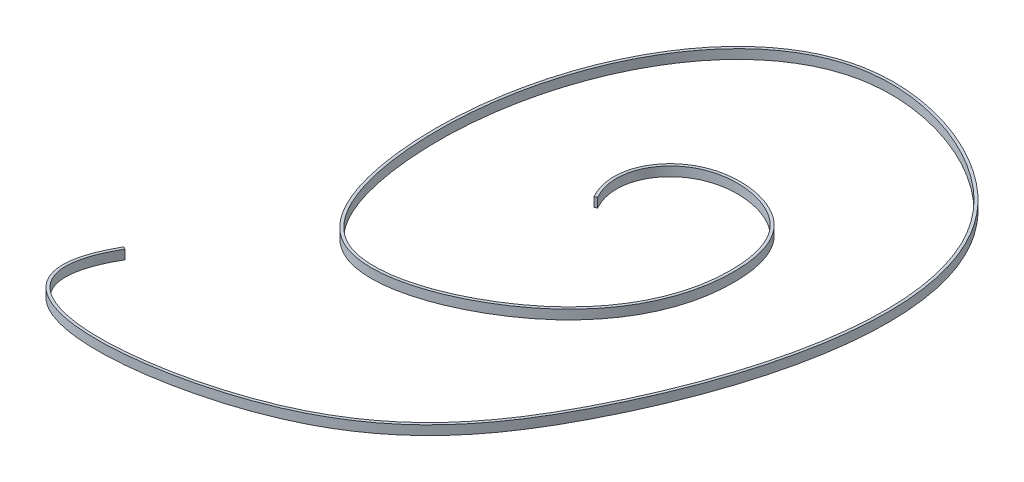
ISO-10303-21;
HEADER;
FILE_DESCRIPTION(('STEP AP214'),'2;1');
FILE_NAME('part.step','',(''),(''),'','','');
FILE_SCHEMA(('AUTOMOTIVE_DESIGN { 1 0 10303 214 1 1 1 1 }'));
ENDSEC;
DATA;
#1=APPLICATION_CONTEXT('core data for automotive mechanical design processes');
#2=APPLICATION_PROTOCOL_DEFINITION('international standard','automotive_design',2000,#1);
#3=PRODUCT_CONTEXT('',#1,'mechanical');
#4=PRODUCT('Part','Part','',(#3));
#5=PRODUCT_RELATED_PRODUCT_CATEGORY('part','',(#4));
#6=PRODUCT_DEFINITION_FORMATION('','',#4);
#7=PRODUCT_DEFINITION_CONTEXT('part definition',#1,'design');
#8=PRODUCT_DEFINITION('design','',#6,#7);
#9=PRODUCT_DEFINITION_SHAPE('','',#8);
#10=(LENGTH_UNIT() NAMED_UNIT(*) SI_UNIT(.MILLI.,.METRE.));
#11=(NAMED_UNIT(*) PLANE_ANGLE_UNIT() SI_UNIT($,.RADIAN.));
#12=(NAMED_UNIT(*) SI_UNIT($,.STERADIAN.) SOLID_ANGLE_UNIT());
#13=UNCERTAINTY_MEASURE_WITH_UNIT(LENGTH_MEASURE(1.E-05),#10,'distance_accuracy_value','');
#14=(GEOMETRIC_REPRESENTATION_CONTEXT(3) GLOBAL_UNCERTAINTY_ASSIGNED_CONTEXT((#13)) GLOBAL_UNIT_ASSIGNED_CONTEXT((#10,
#11,#12)) REPRESENTATION_CONTEXT('',''));
#15=CARTESIAN_POINT('',(0.,0.,0.));
#16=DIRECTION('',(0.,0.,1.));
#17=DIRECTION('',(1.,0.,0.));
#18=AXIS2_PLACEMENT_3D('',#15,#16,#17);
#19=CARTESIAN_POINT('',(1.31157343753039,10.,-0.727856522925171));
#20=CARTESIAN_POINT('',(-1.99609170628711,10.,-6.68815997042503));
#21=CARTESIAN_POINT('',(-4.13255155921997,10.,-12.6699174934191));
#22=CARTESIAN_POINT('',(-6.36912068990896,10.,-24.443140012303));
#23=CARTESIAN_POINT('',(-6.46940317318312,10.,-30.2357425788563));
#24=CARTESIAN_POINT('',(-4.91410915895743,10.,-41.4046321738258));
#25=CARTESIAN_POINT('',(-3.25770484369592,10.,-46.7811936654338));
#26=CARTESIAN_POINT('',(1.54542978061375,10.,-56.871060500445));
#27=CARTESIAN_POINT('',(4.69248721590024,10.,-61.5838849077719));
#28=CARTESIAN_POINT('',(12.2045931030961,10.,-70.0841316503236));
#29=CARTESIAN_POINT('',(16.5695042008434,10.,-73.8712264378421));
#30=CARTESIAN_POINT('',(23.8196261863979,10.,-78.6608436658613));
#31=CARTESIAN_POINT('',(26.3534124304733,10.,-80.1089050709138));
#32=CARTESIAN_POINT('',(31.6198078682662,10.,-82.6757838188294));
#33=CARTESIAN_POINT('',(34.3531734441648,10.,-83.791748201238));
#34=CARTESIAN_POINT('',(42.8006715583312,10.,-86.6339048561434));
#35=CARTESIAN_POINT('',(48.7559271669362,10.,-87.8587792209771));
#36=CARTESIAN_POINT('',(60.9143737105636,10.,-89.0178150748183));
#37=CARTESIAN_POINT('',(67.1173021623212,10.,-88.9519614584062));
#38=CARTESIAN_POINT('',(79.3661911278564,10.,-87.5871106422524));
#39=CARTESIAN_POINT('',(85.4120161419023,10.,-86.2881193855158));
#40=CARTESIAN_POINT('',(96.9424468115446,10.,-82.5229146456646));
#41=CARTESIAN_POINT('',(102.42680817608,10.,-80.0567212039048));
#42=CARTESIAN_POINT('',(112.435487047903,10.,-74.0313000891629));
#43=CARTESIAN_POINT('',(116.959356105377,10.,-70.4725244122631));
#44=CARTESIAN_POINT('',(124.664180691393,10.,-62.3394873161674));
#45=CARTESIAN_POINT('',(127.853337183156,10.,-57.744543750985));
#46=CARTESIAN_POINT('',(133.081569629047,10.,-47.7659314685345));
#47=CARTESIAN_POINT('',(135.118820474709,10.,-42.3837935002649));
#48=CARTESIAN_POINT('',(138.199836067153,10.,-31.1334306419113));
#49=CARTESIAN_POINT('',(139.243429056927,10.,-25.2656583364093));
#50=CARTESIAN_POINT('',(140.502872496692,10.,-13.3556098953358));
#51=CARTESIAN_POINT('',(140.71880941315,10.,-7.31349438731036));
#52=CARTESIAN_POINT('',(140.495323505991,10.,4.63224052843893));
#53=CARTESIAN_POINT('',(140.060940932236,10.,10.5220480301137));
#54=CARTESIAN_POINT('',(136.340032543762,10.,39.5017447543877));
#55=CARTESIAN_POINT('',(128.402862927538,10.,61.2111739880526));
#56=CARTESIAN_POINT('',(104.042296717968,10.,100.871958138674));
#57=CARTESIAN_POINT('',(87.6155947266078,10.,118.821726896916));
#58=CARTESIAN_POINT('',(65.1678667668593,10.,136.40161160724));
#59=CARTESIAN_POINT('',(62.6185952193579,10.,138.318609717023));
#60=CARTESIAN_POINT('',(57.4127494695411,10.,142.078205514152));
#61=CARTESIAN_POINT('',(54.7554694847654,10.,143.92133933439));
#62=CARTESIAN_POINT('',(46.6411237962217,10.,149.325758874715));
#63=CARTESIAN_POINT('',(41.0421475796716,10.,152.761585969065));
#64=CARTESIAN_POINT('',(23.8533071058503,10.,162.439622917565));
#65=CARTESIAN_POINT('',(11.8712842959876,10.,168.052102838419));
#66=CARTESIAN_POINT('',(-12.1938714542314,10.,176.921373193283));
#67=CARTESIAN_POINT('',(-24.2770989572398,10.,180.177641905063));
#68=CARTESIAN_POINT('',(-47.5908203601184,10.,183.672475007568));
#69=CARTESIAN_POINT('',(-58.8195400827275,10.,183.909880079647));
#70=CARTESIAN_POINT('',(-74.3112395067035,10.,181.537318443806));
#71=CARTESIAN_POINT('',(-79.2500916607095,10.,180.29232115226));
#72=CARTESIAN_POINT('',(-86.2395838428847,10.,177.688128891691));
#73=CARTESIAN_POINT('',(-88.4997078592383,10.,176.697279088005));
#74=CARTESIAN_POINT('',(-92.8681274511122,10.,174.460195842698));
#75=CARTESIAN_POINT('',(-94.9762332683239,10.,173.211910438323));
#76=CARTESIAN_POINT('',(-101.085544681221,10.,169.090184786714));
#77=CARTESIAN_POINT('',(-104.870125116999,10.,165.842906028924));
#78=CARTESIAN_POINT('',(-111.894042753897,10.,158.461064366247));
#79=CARTESIAN_POINT('',(-115.133045801923,10.,154.326453836099));
#80=CARTESIAN_POINT('',(-124.067378932293,10.,140.770970923907));
#81=CARTESIAN_POINT('',(-128.978370213353,10.,130.197602171288));
#82=CARTESIAN_POINT('',(-136.912474882741,10.,106.994667209095));
#83=CARTESIAN_POINT('',(-139.936125657045,10.,94.3664704436047));
#84=CARTESIAN_POINT('',(-143.230781207815,10.,74.656879555683));
#85=CARTESIAN_POINT('',(-144.122364555622,10.,67.9591203372012));
#86=CARTESIAN_POINT('',(-145.172615982765,10.,57.817001917743));
#87=CARTESIAN_POINT('',(-145.47485069501,10.,54.4203804470025));
#88=CARTESIAN_POINT('',(-145.987474307717,10.,47.6113454842854));
#89=CARTESIAN_POINT('',(-146.198052167488,10.,44.1997934345628));
#90=CARTESIAN_POINT('',(-147.025154309732,10.,27.1215886306202));
#91=CARTESIAN_POINT('',(-146.963580587337,10.,13.3891341095652));
#92=CARTESIAN_POINT('',(-144.692989913643,10.,-27.6293334419072));
#93=CARTESIAN_POINT('',(-140.397737299061,10.,-54.7364283047862));
#94=CARTESIAN_POINT('',(-126.700244075146,10.,-106.400459502458));
#95=CARTESIAN_POINT('',(-117.297843058788,10.,-130.957151305564));
#96=CARTESIAN_POINT('',(-93.8557222259403,10.,-175.450057709756));
#97=CARTESIAN_POINT('',(-79.8162134753282,10.,-195.385256664037));
#98=CARTESIAN_POINT('',(-47.5860666707704,10.,-228.583954194929));
#99=CARTESIAN_POINT('',(-29.3986762321867,10.,-241.84687364427));
#100=CARTESIAN_POINT('',(0.649007777999809,10.,-255.240164779458));
#101=CARTESIAN_POINT('',(11.1267135327442,10.,-258.621702469332));
#102=CARTESIAN_POINT('',(27.5017166649118,10.,-261.882475557225));
#103=CARTESIAN_POINT('',(33.0745547335467,10.,-262.663748219751));
#104=CARTESIAN_POINT('',(44.3987289852908,10.,-263.635776201996));
#105=CARTESIAN_POINT('',(50.1481711494491,10.,-263.827394390031));
#106=CARTESIAN_POINT('',(79.1728224081749,10.,-263.38042841196));
#107=CARTESIAN_POINT('',(103.280622347588,10.,-258.523283292028));
#108=CARTESIAN_POINT('',(149.169496535976,10.,-241.583691085349));
#109=CARTESIAN_POINT('',(170.949387785612,10.,-229.502043707169));
#110=CARTESIAN_POINT('',(194.165777185925,10.,-211.034404944831));
#111=CARTESIAN_POINT('',(198.608724961932,10.,-207.172741250086));
#112=CARTESIAN_POINT('',(207.030682203292,10.,-199.142436023637));
#113=CARTESIAN_POINT('',(211.007685494834,10.,-194.974504537302));
#114=CARTESIAN_POINT('',(222.162465474313,10.,-182.049282089746));
#115=CARTESIAN_POINT('',(228.588221395688,10.,-172.866101466427));
#116=CARTESIAN_POINT('',(245.071573692531,10.,-143.857275578462));
#117=CARTESIAN_POINT('',(252.336283803175,10.,-122.569596321426));
#118=CARTESIAN_POINT('',(260.630827874101,10.,-77.4108419727723));
#119=CARTESIAN_POINT('',(261.658662865922,10.,-53.5413305038955));
#120=CARTESIAN_POINT('',(258.688502123931,10.,-4.58670232280617));
#121=CARTESIAN_POINT('',(254.690760989839,10.,20.497534892462));
#122=CARTESIAN_POINT('',(237.007521100834,10.,95.5100039542261));
#123=CARTESIAN_POINT('',(217.63079641841,10.,145.196395131923));
#124=CARTESIAN_POINT('',(192.892756008592,10.,194.568135399149));
#125=CARTESIAN_POINT('',(190.106364010508,10.,199.961951640808));
#126=CARTESIAN_POINT('',(184.450386975812,10.,210.554420093338));
#127=CARTESIAN_POINT('',(181.578728209937,10.,215.754280357854));
#128=CARTESIAN_POINT('',(172.798289135462,10.,231.061712126637));
#129=CARTESIAN_POINT('',(166.724058549423,10.,240.877089300397));
#130=CARTESIAN_POINT('',(147.563805489502,10.,269.131698772121));
#131=CARTESIAN_POINT('',(133.54115381236,10.,286.378864092585));
#132=CARTESIAN_POINT('',(101.514202322097,10.,317.589241324339));
#133=CARTESIAN_POINT('',(83.5096387267078,10.,331.553886038375));
#134=CARTESIAN_POINT('',(52.3826362084777,10.,349.958177034545));
#135=CARTESIAN_POINT('',(41.3200939309696,10.,355.668952646261));
#136=CARTESIAN_POINT('',(23.5541044168628,10.,363.586759638323));
#137=CARTESIAN_POINT('',(17.4367523239497,10.,366.117953849826));
#138=CARTESIAN_POINT('',(7.95004488038671,10.,369.750974886365));
#139=CARTESIAN_POINT('',(4.73602990378553,10.,370.934686232475));
#140=CARTESIAN_POINT('',(-1.79849047913696,10.,373.247235108946));
#141=CARTESIAN_POINT('',(-5.12028042724947,10.,374.376424377797));
#142=CARTESIAN_POINT('',(-35.442005731669,10.,384.272815821242));
#143=CARTESIAN_POINT('',(-65.3996955295021,10.,391.167222422291));
#144=CARTESIAN_POINT('',(-108.442611061017,10.,396.525896622707));
#145=CARTESIAN_POINT('',(-122.474710353097,10.,397.481842170444));
#146=CARTESIAN_POINT('',(-148.832397171833,10.,397.386900619266));
#147=CARTESIAN_POINT('',(-161.158174933573,10.,396.334797695182));
#148=CARTESIAN_POINT('',(-177.548664533204,10.,393.009633292294));
#149=CARTESIAN_POINT('',(-182.662209161285,10.,391.610370336129));
#150=CARTESIAN_POINT('',(-192.05329997467,10.,388.197503122953));
#151=CARTESIAN_POINT('',(-196.330413608328,10.,386.18396892745));
#152=CARTESIAN_POINT('',(-203.920565243992,10.,381.517281615985));
#153=CARTESIAN_POINT('',(-207.233180499266,10.,378.865097360051));
#154=CARTESIAN_POINT('',(-212.790198571741,10.,372.890805510295));
#155=CARTESIAN_POINT('',(-215.036169408234,10.,369.569606578398));
#156=CARTESIAN_POINT('',(-218.370114980303,10.,362.184995399195));
#157=CARTESIAN_POINT('',(-219.459180003198,10.,358.119250331255));
#158=CARTESIAN_POINT('',(-220.34620941465,10.,349.14698359439));
#159=CARTESIAN_POINT('',(-220.142451433591,10.,344.239824948314));
#160=CARTESIAN_POINT('',(-218.279816268623,10.,333.52490598928));
#161=CARTESIAN_POINT('',(-216.620467855819,10.,327.718114350905));
#162=CARTESIAN_POINT('',(-211.695807660268,10.,315.170365252245));
#163=CARTESIAN_POINT('',(-208.430732547278,10.,308.429791124968));
#164=CARTESIAN_POINT('',(-204.293701014468,10.,301.205797866783));
#165=B_SPLINE_CURVE_WITH_KNOTS('',3,(#19,#20,#21,#22,#23,#24,#25,#26,#27,#28,#29,#30,#31,#32,
#33,#34,#35,#36,#37,#38,#39,#40,#41,#42,#43,#44,#45,#46,#47,#48,#49,#50,#51,#52,#53,#54,#55,#56,
#57,#58,#59,#60,#61,#62,#63,#64,#65,#66,#67,#68,#69,#70,#71,#72,#73,#74,#75,#76,#77,#78,#79,#80,
#81,#82,#83,#84,#85,#86,#87,#88,#89,#90,#91,#92,#93,#94,#95,#96,#97,#98,#99,#100,#101,#102,#103,
#104,#105,#106,#107,#108,#109,#110,#111,#112,#113,#114,#115,#116,#117,#118,#119,#120,#121,#122,
#123,#124,#125,#126,#127,#128,#129,#130,#131,#132,#133,#134,#135,#136,#137,#138,#139,#140,#141,
#142,#143,#144,#145,#146,#147,#148,#149,#150,#151,#152,#153,#154,#155,#156,#157,#158,#159,#160,
#161,#162,#163,#164),.UNSPECIFIED.,.F.,.F.,(4,2,2,2,2,2,2,2,2,2,2,2,2,2,2,2,2,2,2,2,2,2,2,2,2,2,
2,2,2,2,2,2,2,2,2,2,2,2,2,2,2,2,2,2,2,2,2,2,2,2,2,2,2,2,2,2,2,2,2,2,2,2,2,2,2,2,2,2,2,2,2,2,4),
(0.,0.0078125,0.015625,0.0234375,0.03125,0.0390625,0.04296875,0.046875,0.0546875,0.0625,
0.0703125,0.078125,0.0859375,0.09375,0.1015625,0.109375,0.1171875,0.125,0.15625,0.1875,
0.19140625,0.1953125,0.203125,0.21875,0.234375,0.25,0.2578125,0.26171875,0.265625,0.2734375,
0.28125,0.296875,0.3125,0.3203125,0.32421875,0.328125,0.34375,0.375,0.40625,0.4375,0.46875,
0.484375,0.4921875,0.5,0.53125,0.5625,0.5703125,0.578125,0.59375,0.625,0.65625,0.6875,0.75,
0.7578125,0.765625,0.78125,0.8125,0.84375,0.859375,0.8671875,0.87109375,0.875,0.90625,0.921875,
0.9375,0.9453125,0.953125,0.9609375,0.96875,0.9765625,0.984375,0.9921875,1.),.UNSPECIFIED.);
#166=DIRECTION('',(0.,-1.,0.));
#167=VECTOR('',#166,1.);
#168=SURFACE_OF_LINEAR_EXTRUSION('',#165,#167);
#169=CARTESIAN_POINT('',(1.31157343753039,0.,-0.727856522925171));
#170=CARTESIAN_POINT('',(-1.99609170628711,0.,-6.68815997042503));
#171=CARTESIAN_POINT('',(-4.13255155921997,0.,-12.6699174934191));
#172=CARTESIAN_POINT('',(-6.36912068990896,0.,-24.443140012303));
#173=CARTESIAN_POINT('',(-6.46940317318312,0.,-30.2357425788563));
#174=CARTESIAN_POINT('',(-4.91410915895743,0.,-41.4046321738258));
#175=CARTESIAN_POINT('',(-3.25770484369592,0.,-46.7811936654338));
#176=CARTESIAN_POINT('',(1.54542978061375,0.,-56.871060500445));
#177=CARTESIAN_POINT('',(4.69248721590024,0.,-61.5838849077719));
#178=CARTESIAN_POINT('',(12.2045931030961,0.,-70.0841316503236));
#179=CARTESIAN_POINT('',(16.5695042008434,0.,-73.8712264378421));
#180=CARTESIAN_POINT('',(23.8196261863979,0.,-78.6608436658613));
#181=CARTESIAN_POINT('',(26.3534124304733,0.,-80.1089050709138));
#182=CARTESIAN_POINT('',(31.6198078682662,0.,-82.6757838188294));
#183=CARTESIAN_POINT('',(34.3531734441648,0.,-83.791748201238));
#184=CARTESIAN_POINT('',(42.8006715583312,0.,-86.6339048561434));
#185=CARTESIAN_POINT('',(48.7559271669362,0.,-87.8587792209771));
#186=CARTESIAN_POINT('',(60.9143737105636,0.,-89.0178150748183));
#187=CARTESIAN_POINT('',(67.1173021623212,0.,-88.9519614584062));
#188=CARTESIAN_POINT('',(79.3661911278564,0.,-87.5871106422524));
#189=CARTESIAN_POINT('',(85.4120161419023,0.,-86.2881193855158));
#190=CARTESIAN_POINT('',(96.9424468115446,0.,-82.5229146456646));
#191=CARTESIAN_POINT('',(102.42680817608,0.,-80.0567212039048));
#192=CARTESIAN_POINT('',(112.435487047903,0.,-74.0313000891629));
#193=CARTESIAN_POINT('',(116.959356105377,0.,-70.4725244122631));
#194=CARTESIAN_POINT('',(124.664180691393,0.,-62.3394873161674));
#195=CARTESIAN_POINT('',(127.853337183156,0.,-57.744543750985));
#196=CARTESIAN_POINT('',(133.081569629047,0.,-47.7659314685345));
#197=CARTESIAN_POINT('',(135.118820474709,0.,-42.3837935002649));
#198=CARTESIAN_POINT('',(138.199836067153,0.,-31.1334306419113));
#199=CARTESIAN_POINT('',(139.243429056927,0.,-25.2656583364093));
#200=CARTESIAN_POINT('',(140.502872496692,0.,-13.3556098953358));
#201=CARTESIAN_POINT('',(140.71880941315,0.,-7.31349438731036));
#202=CARTESIAN_POINT('',(140.495323505991,0.,4.63224052843893));
#203=CARTESIAN_POINT('',(140.060940932236,0.,10.5220480301137));
#204=CARTESIAN_POINT('',(136.340032543762,0.,39.5017447543877));
#205=CARTESIAN_POINT('',(128.402862927538,0.,61.2111739880526));
#206=CARTESIAN_POINT('',(104.042296717968,0.,100.871958138674));
#207=CARTESIAN_POINT('',(87.6155947266078,0.,118.821726896916));
#208=CARTESIAN_POINT('',(65.1678667668593,0.,136.40161160724));
#209=CARTESIAN_POINT('',(62.6185952193579,0.,138.318609717023));
#210=CARTESIAN_POINT('',(57.4127494695411,0.,142.078205514152));
#211=CARTESIAN_POINT('',(54.7554694847654,0.,143.92133933439));
#212=CARTESIAN_POINT('',(46.6411237962217,0.,149.325758874715));
#213=CARTESIAN_POINT('',(41.0421475796716,0.,152.761585969065));
#214=CARTESIAN_POINT('',(23.8533071058503,0.,162.439622917565));
#215=CARTESIAN_POINT('',(11.8712842959876,0.,168.052102838419));
#216=CARTESIAN_POINT('',(-12.1938714542314,0.,176.921373193283));
#217=CARTESIAN_POINT('',(-24.2770989572398,0.,180.177641905063));
#218=CARTESIAN_POINT('',(-47.5908203601184,0.,183.672475007568));
#219=CARTESIAN_POINT('',(-58.8195400827275,0.,183.909880079647));
#220=CARTESIAN_POINT('',(-74.3112395067035,0.,181.537318443806));
#221=CARTESIAN_POINT('',(-79.2500916607095,0.,180.29232115226));
#222=CARTESIAN_POINT('',(-86.2395838428847,0.,177.688128891691));
#223=CARTESIAN_POINT('',(-88.4997078592383,0.,176.697279088005));
#224=CARTESIAN_POINT('',(-92.8681274511122,0.,174.460195842698));
#225=CARTESIAN_POINT('',(-94.9762332683239,0.,173.211910438323));
#226=CARTESIAN_POINT('',(-101.085544681221,0.,169.090184786714));
#227=CARTESIAN_POINT('',(-104.870125116999,0.,165.842906028924));
#228=CARTESIAN_POINT('',(-111.894042753897,0.,158.461064366247));
#229=CARTESIAN_POINT('',(-115.133045801923,0.,154.326453836099));
#230=CARTESIAN_POINT('',(-124.067378932293,0.,140.770970923907));
#231=CARTESIAN_POINT('',(-128.978370213353,0.,130.197602171288));
#232=CARTESIAN_POINT('',(-136.912474882741,0.,106.994667209095));
#233=CARTESIAN_POINT('',(-139.936125657045,0.,94.3664704436047));
#234=CARTESIAN_POINT('',(-143.230781207815,0.,74.656879555683));
#235=CARTESIAN_POINT('',(-144.122364555622,0.,67.9591203372012));
#236=CARTESIAN_POINT('',(-145.172615982765,0.,57.817001917743));
#237=CARTESIAN_POINT('',(-145.47485069501,0.,54.4203804470025));
#238=CARTESIAN_POINT('',(-145.987474307717,0.,47.6113454842854));
#239=CARTESIAN_POINT('',(-146.198052167488,0.,44.1997934345628));
#240=CARTESIAN_POINT('',(-147.025154309732,0.,27.1215886306202));
#241=CARTESIAN_POINT('',(-146.963580587337,0.,13.3891341095652));
#242=CARTESIAN_POINT('',(-144.692989913643,0.,-27.6293334419072));
#243=CARTESIAN_POINT('',(-140.397737299061,0.,-54.7364283047862));
#244=CARTESIAN_POINT('',(-126.700244075146,0.,-106.400459502458));
#245=CARTESIAN_POINT('',(-117.297843058788,0.,-130.957151305564));
#246=CARTESIAN_POINT('',(-93.8557222259403,0.,-175.450057709756));
#247=CARTESIAN_POINT('',(-79.8162134753282,0.,-195.385256664037));
#248=CARTESIAN_POINT('',(-47.5860666707704,0.,-228.583954194929));
#249=CARTESIAN_POINT('',(-29.3986762321867,0.,-241.84687364427));
#250=CARTESIAN_POINT('',(0.649007777999809,0.,-255.240164779458));
#251=CARTESIAN_POINT('',(11.1267135327442,0.,-258.621702469332));
#252=CARTESIAN_POINT('',(27.5017166649118,0.,-261.882475557225));
#253=CARTESIAN_POINT('',(33.0745547335467,0.,-262.663748219751));
#254=CARTESIAN_POINT('',(44.3987289852908,0.,-263.635776201996));
#255=CARTESIAN_POINT('',(50.1481711494491,0.,-263.827394390031));
#256=CARTESIAN_POINT('',(79.1728224081749,0.,-263.38042841196));
#257=CARTESIAN_POINT('',(103.280622347588,0.,-258.523283292028));
#258=CARTESIAN_POINT('',(149.169496535976,0.,-241.583691085349));
#259=CARTESIAN_POINT('',(170.949387785612,0.,-229.502043707169));
#260=CARTESIAN_POINT('',(194.165777185925,0.,-211.034404944831));
#261=CARTESIAN_POINT('',(198.608724961932,0.,-207.172741250086));
#262=CARTESIAN_POINT('',(207.030682203292,0.,-199.142436023637));
#263=CARTESIAN_POINT('',(211.007685494834,0.,-194.974504537302));
#264=CARTESIAN_POINT('',(222.162465474313,0.,-182.049282089746));
#265=CARTESIAN_POINT('',(228.588221395688,0.,-172.866101466427));
#266=CARTESIAN_POINT('',(245.071573692531,0.,-143.857275578462));
#267=CARTESIAN_POINT('',(252.336283803175,0.,-122.569596321426));
#268=CARTESIAN_POINT('',(260.630827874101,0.,-77.4108419727723));
#269=CARTESIAN_POINT('',(261.658662865922,0.,-53.5413305038955));
#270=CARTESIAN_POINT('',(258.688502123931,0.,-4.58670232280617));
#271=CARTESIAN_POINT('',(254.690760989839,0.,20.497534892462));
#272=CARTESIAN_POINT('',(237.007521100834,0.,95.5100039542261));
#273=CARTESIAN_POINT('',(217.63079641841,0.,145.196395131923));
#274=CARTESIAN_POINT('',(192.892756008592,0.,194.568135399149));
#275=CARTESIAN_POINT('',(190.106364010508,0.,199.961951640808));
#276=CARTESIAN_POINT('',(184.450386975812,0.,210.554420093338));
#277=CARTESIAN_POINT('',(181.578728209937,0.,215.754280357854));
#278=CARTESIAN_POINT('',(172.798289135462,0.,231.061712126637));
#279=CARTESIAN_POINT('',(166.724058549423,0.,240.877089300397));
#280=CARTESIAN_POINT('',(147.563805489502,0.,269.131698772121));
#281=CARTESIAN_POINT('',(133.54115381236,0.,286.378864092585));
#282=CARTESIAN_POINT('',(101.514202322097,0.,317.589241324339));
#283=CARTESIAN_POINT('',(83.5096387267078,0.,331.553886038375));
#284=CARTESIAN_POINT('',(52.3826362084777,0.,349.958177034545));
#285=CARTESIAN_POINT('',(41.3200939309696,0.,355.668952646261));
#286=CARTESIAN_POINT('',(23.5541044168628,0.,363.586759638323));
#287=CARTESIAN_POINT('',(17.4367523239497,0.,366.117953849826));
#288=CARTESIAN_POINT('',(7.95004488038671,0.,369.750974886365));
#289=CARTESIAN_POINT('',(4.73602990378553,0.,370.934686232475));
#290=CARTESIAN_POINT('',(-1.79849047913696,0.,373.247235108946));
#291=CARTESIAN_POINT('',(-5.12028042724947,0.,374.376424377797));
#292=CARTESIAN_POINT('',(-35.442005731669,0.,384.272815821242));
#293=CARTESIAN_POINT('',(-65.3996955295021,0.,391.167222422291));
#294=CARTESIAN_POINT('',(-108.442611061017,0.,396.525896622707));
#295=CARTESIAN_POINT('',(-122.474710353097,0.,397.481842170444));
#296=CARTESIAN_POINT('',(-148.832397171833,0.,397.386900619266));
#297=CARTESIAN_POINT('',(-161.158174933573,0.,396.334797695182));
#298=CARTESIAN_POINT('',(-177.548664533204,0.,393.009633292294));
#299=CARTESIAN_POINT('',(-182.662209161285,0.,391.610370336129));
#300=CARTESIAN_POINT('',(-192.05329997467,0.,388.197503122953));
#301=CARTESIAN_POINT('',(-196.330413608328,0.,386.18396892745));
#302=CARTESIAN_POINT('',(-203.920565243992,0.,381.517281615985));
#303=CARTESIAN_POINT('',(-207.233180499266,0.,378.865097360051));
#304=CARTESIAN_POINT('',(-212.790198571741,0.,372.890805510295));
#305=CARTESIAN_POINT('',(-215.036169408234,0.,369.569606578398));
#306=CARTESIAN_POINT('',(-218.370114980303,0.,362.184995399195));
#307=CARTESIAN_POINT('',(-219.459180003198,0.,358.119250331255));
#308=CARTESIAN_POINT('',(-220.34620941465,0.,349.14698359439));
#309=CARTESIAN_POINT('',(-220.142451433591,0.,344.239824948314));
#310=CARTESIAN_POINT('',(-218.279816268623,0.,333.52490598928));
#311=CARTESIAN_POINT('',(-216.620467855819,0.,327.718114350905));
#312=CARTESIAN_POINT('',(-211.695807660268,0.,315.170365252245));
#313=CARTESIAN_POINT('',(-208.430732547278,0.,308.429791124968));
#314=CARTESIAN_POINT('',(-204.293701014468,0.,301.205797866783));
#315=B_SPLINE_CURVE_WITH_KNOTS('',3,(#169,#170,#171,#172,#173,#174,#175,#176,#177,#178,#179,
#180,#181,#182,#183,#184,#185,#186,#187,#188,#189,#190,#191,#192,#193,#194,#195,#196,#197,#198,
#199,#200,#201,#202,#203,#204,#205,#206,#207,#208,#209,#210,#211,#212,#213,#214,#215,#216,#217,
#218,#219,#220,#221,#222,#223,#224,#225,#226,#227,#228,#229,#230,#231,#232,#233,#234,#235,#236,
#237,#238,#239,#240,#241,#242,#243,#244,#245,#246,#247,#248,#249,#250,#251,#252,#253,#254,#255,
#256,#257,#258,#259,#260,#261,#262,#263,#264,#265,#266,#267,#268,#269,#270,#271,#272,#273,#274,
#275,#276,#277,#278,#279,#280,#281,#282,#283,#284,#285,#286,#287,#288,#289,#290,#291,#292,#293,
#294,#295,#296,#297,#298,#299,#300,#301,#302,#303,#304,#305,#306,#307,#308,#309,#310,#311,#312,
#313,#314),.UNSPECIFIED.,.F.,.F.,(4,2,2,2,2,2,2,2,2,2,2,2,2,2,2,2,2,2,2,2,2,2,2,2,2,2,2,2,2,2,2,
2,2,2,2,2,2,2,2,2,2,2,2,2,2,2,2,2,2,2,2,2,2,2,2,2,2,2,2,2,2,2,2,2,2,2,2,2,2,2,2,2,4),(0.,
0.0078125,0.015625,0.0234375,0.03125,0.0390625,0.04296875,0.046875,0.0546875,0.0625,0.0703125,
0.078125,0.0859375,0.09375,0.1015625,0.109375,0.1171875,0.125,0.15625,0.1875,0.19140625,
0.1953125,0.203125,0.21875,0.234375,0.25,0.2578125,0.26171875,0.265625,0.2734375,0.28125,
0.296875,0.3125,0.3203125,0.32421875,0.328125,0.34375,0.375,0.40625,0.4375,0.46875,0.484375,
0.4921875,0.5,0.53125,0.5625,0.5703125,0.578125,0.59375,0.625,0.65625,0.6875,0.75,0.7578125,
0.765625,0.78125,0.8125,0.84375,0.859375,0.8671875,0.87109375,0.875,0.90625,0.921875,0.9375,
0.9453125,0.953125,0.9609375,0.96875,0.9765625,0.984375,0.9921875,1.),.UNSPECIFIED.);
#316=CARTESIAN_POINT('',(1.31157343753039,0.,-0.727856522925171));
#317=VERTEX_POINT('',#316);
#318=CARTESIAN_POINT('',(-204.293701014468,0.,301.205797866782));
#319=VERTEX_POINT('',#318);
#320=EDGE_CURVE('E117',#317,#319,#315,.T.);
#321=ORIENTED_EDGE('',*,*,#320,.T.);
#322=DIRECTION('',(0.,-1.,0.));
#323=VECTOR('',#322,1.);
#324=CARTESIAN_POINT('',(-204.293701014468,10.,301.205797866782));
#325=LINE('',#324,#323);
#326=CARTESIAN_POINT('',(-204.293701014468,10.,301.205797866782));
#327=VERTEX_POINT('',#326);
#328=EDGE_CURVE('E11',#327,#319,#325,.T.);
#329=ORIENTED_EDGE('',*,*,#328,.F.);
#330=CARTESIAN_POINT('',(1.31157343753039,10.,-0.727856522925171));
#331=VERTEX_POINT('',#330);
#332=EDGE_CURVE('E78',#331,#327,#165,.T.);
#333=ORIENTED_EDGE('',*,*,#332,.F.);
#334=DIRECTION('',(0.,-1.,0.));
#335=VECTOR('',#334,1.);
#336=CARTESIAN_POINT('',(1.31157343753039,10.,-0.727856522925171));
#337=LINE('',#336,#335);
#338=EDGE_CURVE('E54',#331,#317,#337,.T.);
#339=ORIENTED_EDGE('',*,*,#338,.T.);
#340=EDGE_LOOP('',(#321,#329,#333,#339));
#341=FACE_BOUND('',#340,.T.);
#342=ADVANCED_FACE('F37',(#341),#168,.F.);
#343=CARTESIAN_POINT('',(-206.897026656246,10.,299.714927113545));
#344=DIRECTION('',(0.496956917745687,0.,-0.867775213926225));
#345=DIRECTION('',(-0.867775213926225,0.,-0.496956917745687));
#346=AXIS2_PLACEMENT_3D('',#343,#344,#345);
#347=PLANE('',#346);
#348=DIRECTION('',(0.867775213926225,0.,0.496956917745687));
#349=VECTOR('',#348,1.);
#350=CARTESIAN_POINT('',(-206.897026656246,0.,299.714927113545));
#351=LINE('',#350,#349);
#352=CARTESIAN_POINT('',(-206.897026656246,0.,299.714927113545));
#353=VERTEX_POINT('',#352);
#354=EDGE_CURVE('E87',#353,#319,#351,.T.);
#355=ORIENTED_EDGE('',*,*,#354,.F.);
#356=DIRECTION('',(0.,-1.,0.));
#357=VECTOR('',#356,1.);
#358=CARTESIAN_POINT('',(-206.897026656246,10.,299.714927113545));
#359=LINE('',#358,#357);
#360=CARTESIAN_POINT('',(-206.897026656246,10.,299.714927113545));
#361=VERTEX_POINT('',#360);
#362=EDGE_CURVE('E46',#361,#353,#359,.T.);
#363=ORIENTED_EDGE('',*,*,#362,.F.);
#364=DIRECTION('',(0.867775213926225,0.,0.496956917745687));
#365=VECTOR('',#364,1.);
#366=CARTESIAN_POINT('',(-206.897026656246,10.,299.714927113545));
#367=LINE('',#366,#365);
#368=EDGE_CURVE('E85',#361,#327,#367,.T.);
#369=ORIENTED_EDGE('',*,*,#368,.T.);
#370=ORIENTED_EDGE('',*,*,#328,.T.);
#371=EDGE_LOOP('',(#355,#363,#369,#370));
#372=FACE_BOUND('',#371,.T.);
#373=ADVANCED_FACE('F84',(#372),#347,.T.);
#374=CARTESIAN_POINT('',(-1.31157343753039,10.,0.727856522925171));
#375=CARTESIAN_POINT('',(-4.7666731407205,10.,-5.49811913572695));
#376=CARTESIAN_POINT('',(-7.01856828405101,10.,-11.7874827673039));
#377=CARTESIAN_POINT('',(-9.37768217876438,10.,-24.2057766839758));
#378=CARTESIAN_POINT('',(-9.48472772462922,10.,-30.3335693984071));
#379=CARTESIAN_POINT('',(-7.84144356437265,10.,-42.134334521396));
#380=CARTESIAN_POINT('',(-6.0919416760129,10.,-47.8070324667617));
#381=CARTESIAN_POINT('',(-1.03782239468392,10.,-58.4241386912622));
#382=CARTESIAN_POINT('',(2.26646787204701,10.,-63.3690279064734));
#383=CARTESIAN_POINT('',(10.134706152918,10.,-72.2722526241377));
#384=CARTESIAN_POINT('',(14.6987915212201,10.,-76.230915674297));
#385=CARTESIAN_POINT('',(22.2745562569907,10.,-81.2356608863311));
#386=CARTESIAN_POINT('',(24.9214642570655,10.,-82.7483412418857));
#387=CARTESIAN_POINT('',(30.4229472231945,10.,-85.4298033300601));
#388=CARTESIAN_POINT('',(33.2788522116854,10.,-86.5955396980545));
#389=CARTESIAN_POINT('',(42.0793519665848,10.,-89.5564635842564));
#390=CARTESIAN_POINT('',(48.2580674260545,10.,-90.8249196404542));
#391=CARTESIAN_POINT('',(60.8428489400863,10.,-92.0245969952201));
#392=CARTESIAN_POINT('',(67.2491774779134,10.,-91.9558333992076));
#393=CARTESIAN_POINT('',(79.8987626905061,10.,-90.5463344030135));
#394=CARTESIAN_POINT('',(86.1421548650032,10.,-89.2055930598267));
#395=CARTESIAN_POINT('',(98.0747930488542,10.,-85.3090494582892));
#396=CARTESIAN_POINT('',(103.764283349269,10.,-82.7532271585839));
#397=CARTESIAN_POINT('',(114.192616561201,10.,-76.4751658948109));
#398=CARTESIAN_POINT('',(118.931907922534,10.,-72.7524749346611));
#399=CARTESIAN_POINT('',(125.018517384707,10.,-66.3275888139378));
#400=CARTESIAN_POINT('',(126.871195960223,10.,-64.0482845890325));
#401=CARTESIAN_POINT('',(130.241883678149,10.,-59.2603121909217));
#402=CARTESIAN_POINT('',(131.760651713661,10.,-56.7511565894177));
#403=CARTESIAN_POINT('',(135.853100438725,10.,-48.9403028188816));
#404=CARTESIAN_POINT('',(137.963097703741,10.,-43.3557795545581));
#405=CARTESIAN_POINT('',(141.14247573987,10.,-31.7462451341379));
#406=CARTESIAN_POINT('',(142.21202826799,10.,-25.7207813934591));
#407=CARTESIAN_POINT('',(143.501005203058,10.,-13.5314466036827));
#408=CARTESIAN_POINT('',(143.720343143539,10.,-7.36741492703907));
#409=CARTESIAN_POINT('',(143.492740035456,10.,4.79839198993847));
#410=CARTESIAN_POINT('',(143.050437450569,10.,10.7956610283735));
#411=CARTESIAN_POINT('',(139.259910966913,10.,40.3175670935561));
#412=CARTESIAN_POINT('',(131.166171303935,10.,62.4442862407567));
#413=CARTESIAN_POINT('',(106.391587231662,10.,102.779121763825));
#414=CARTESIAN_POINT('',(89.7140482203808,10.,120.988824298409));
#415=CARTESIAN_POINT('',(66.9864884174738,10.,138.787858650506));
#416=CARTESIAN_POINT('',(64.4061027603095,10.,140.728233684575));
#417=CARTESIAN_POINT('',(59.1380736819835,10.,144.532737493149));
#418=CARTESIAN_POINT('',(56.4497274580782,10.,146.39740476057));
#419=CARTESIAN_POINT('',(48.2416214734961,10.,151.864271723702));
#420=CARTESIAN_POINT('',(42.5794448061141,10.,155.338862982061));
#421=CARTESIAN_POINT('',(25.1942915968278,10.,165.127432220985));
#422=CARTESIAN_POINT('',(13.0729385762038,10.,170.806491264147));
#423=CARTESIAN_POINT('',(-11.3206426221339,10.,179.796803598586));
#424=CARTESIAN_POINT('',(-23.5927762371955,10.,183.108578612093));
#425=CARTESIAN_POINT('',(-47.3856542287942,10.,186.675239471249));
#426=CARTESIAN_POINT('',(-58.9081727825921,10.,186.931284635541));
#427=CARTESIAN_POINT('',(-74.9481575450448,10.,184.47475282161));
#428=CARTESIAN_POINT('',(-80.0873379151512,10.,183.181840829176));
#429=CARTESIAN_POINT('',(-87.3920910749824,10.,180.460186501739));
#430=CARTESIAN_POINT('',(-89.7595815986039,10.,179.422590332416));
#431=CARTESIAN_POINT('',(-94.3431215824399,10.,177.075343167535));
#432=CARTESIAN_POINT('',(-96.5569895394691,10.,175.764345682378));
#433=CARTESIAN_POINT('',(-102.957559806617,10.,171.44611849243));
#434=CARTESIAN_POINT('',(-106.907245486927,10.,168.054059688028));
#435=CARTESIAN_POINT('',(-114.203633842713,10.,160.385862773407));
#436=CARTESIAN_POINT('',(-117.550670671281,10.,156.10977228845));
#437=CARTESIAN_POINT('',(-126.746743464034,10.,142.157168800038));
#438=CARTESIAN_POINT('',(-131.752404522843,10.,131.357168811876));
#439=CARTESIAN_POINT('',(-139.815704795876,10.,107.776407073545));
#440=CARTESIAN_POINT('',(-142.872806624121,10.,94.9942758792934));
#441=CARTESIAN_POINT('',(-146.200857784516,10.,75.0849027097302));
#442=CARTESIAN_POINT('',(-147.100439641654,10.,68.3257618894053));
#443=CARTESIAN_POINT('',(-148.159643300054,10.,58.0971931332288));
#444=CARTESIAN_POINT('',(-148.464344829344,10.,54.6726960258537));
#445=CARTESIAN_POINT('',(-148.981048263465,10.,47.8094699452055));
#446=CARTESIAN_POINT('',(-149.193256802615,10.,44.3714121506313));
#447=CARTESIAN_POINT('',(-150.02677546787,10.,27.160717429791));
#448=CARTESIAN_POINT('',(-149.964625248892,10.,13.3250365544974));
#449=CARTESIAN_POINT('',(-147.677143244151,10.,-27.9985747300292));
#450=CARTESIAN_POINT('',(-143.351146267355,10.,-55.3030959537565));
#451=CARTESIAN_POINT('',(-129.546462871957,10.,-107.371425680585));
#452=CARTESIAN_POINT('',(-120.067936860379,10.,-132.135478715372));
#453=CARTESIAN_POINT('',(-96.3939177090823,10.,-177.06852576433));
#454=CARTESIAN_POINT('',(-82.1982135034844,10.,-197.238535425306));
#455=CARTESIAN_POINT('',(-49.5090399756314,10.,-230.910053928366));
#456=CARTESIAN_POINT('',(-31.0123230380143,10.,-244.41214189772));
#457=CARTESIAN_POINT('',(-0.376218800118755,10.,-258.06771226271));
#458=CARTESIAN_POINT('',(10.3169427251278,10.,-261.519353468252));
#459=CARTESIAN_POINT('',(27.02776685499,10.,-264.846998975209));
#460=CARTESIAN_POINT('',(32.7125259472968,10.,-265.643704505684));
#461=CARTESIAN_POINT('',(44.2476253950512,10.,-266.633837577813));
#462=CARTESIAN_POINT('',(50.0978808271023,10.,-266.828524534525));
#463=CARTESIAN_POINT('',(79.6049492579343,10.,-266.374129558903));
#464=CARTESIAN_POINT('',(104.028866537405,10.,-261.444948548118));
#465=CARTESIAN_POINT('',(150.49906591228,10.,-244.290763768126));
#466=CARTESIAN_POINT('',(172.546531007025,10.,-232.064960290354));
#467=CARTESIAN_POINT('',(200.81184473061,10.,-209.581119485018));
#468=CARTESIAN_POINT('',(209.43022500546,10.,-201.394022065012));
#469=CARTESIAN_POINT('',(224.563979211504,10.,-183.858298371708));
#470=CARTESIAN_POINT('',(231.103242365616,10.,-174.512412793821));
#471=CARTESIAN_POINT('',(247.866517390613,10.,-145.010954731475));
#472=CARTESIAN_POINT('',(255.234985621704,10.,-123.394330892708));
#473=CARTESIAN_POINT('',(263.633407218978,10.,-77.6700265084461));
#474=CARTESIAN_POINT('',(264.665359553623,10.,-53.5607823402102));
#475=CARTESIAN_POINT('',(261.670792663659,10.,-4.20388842230849));
#476=CARTESIAN_POINT('',(257.64401883933,10.,21.0446408243019));
#477=CARTESIAN_POINT('',(239.860893521315,10.,96.4808248105024));
#478=CARTESIAN_POINT('',(220.402947623383,10.,146.360673881222));
#479=CARTESIAN_POINT('',(195.563652419386,10.,195.93449666251));
#480=CARTESIAN_POINT('',(192.765898072519,10.,201.350353582875));
#481=CARTESIAN_POINT('',(187.083588032087,10.,211.992138277463));
#482=CARTESIAN_POINT('',(184.197303392542,10.,217.218567199263));
#483=CARTESIAN_POINT('',(175.367992990779,10.,232.611199093186));
#484=CARTESIAN_POINT('',(169.254498246019,10.,242.490792499576));
#485=CARTESIAN_POINT('',(149.951741022313,10.,270.955545307258));
#486=CARTESIAN_POINT('',(135.799273455392,10.,288.367222225008));
#487=CARTESIAN_POINT('',(103.443589673892,10.,319.897950234477));
#488=CARTESIAN_POINT('',(85.2406372415819,10.,334.015568523449));
#489=CARTESIAN_POINT('',(53.8074391252758,10.,352.60090210107));
#490=CARTESIAN_POINT('',(42.6417600924407,10.,358.364373025497));
#491=CARTESIAN_POINT('',(24.7251073671283,10.,366.34932641693));
#492=CARTESIAN_POINT('',(18.5581936679176,10.,368.900950763138));
#493=CARTESIAN_POINT('',(8.99866502661169,10.,372.561859340731));
#494=CARTESIAN_POINT('',(5.76062840880929,10.,373.754408162259));
#495=CARTESIAN_POINT('',(-0.821360167337589,10.,376.083755902376));
#496=CARTESIAN_POINT('',(-4.16651000167869,10.,377.220875995587));
#497=CARTESIAN_POINT('',(-34.6948246201137,10.,387.184693968986));
#498=CARTESIAN_POINT('',(-64.8137061643598,10.,394.117428560716));
#499=CARTESIAN_POINT('',(-108.17966516105,10.,399.516320405803));
#500=CARTESIAN_POINT('',(-122.332860297553,10.,400.482372582624));
#501=CARTESIAN_POINT('',(-148.995859351974,10.,400.386331283299));
#502=CARTESIAN_POINT('',(-161.505473034808,10.,399.325453632323));
#503=CARTESIAN_POINT('',(-178.269711747253,10.,395.924466159112));
#504=CARTESIAN_POINT('',(-183.524683414067,10.,394.488898320991));
#505=CARTESIAN_POINT('',(-193.24018363608,10.,390.958135726294));
#506=CARTESIAN_POINT('',(-197.701144742925,10.,388.86287090821));
#507=CARTESIAN_POINT('',(-205.692379097746,10.,383.949584091731));
#508=CARTESIAN_POINT('',(-209.223075092454,10.,381.130593233308));
#509=CARTESIAN_POINT('',(-215.193594093292,10.,374.711750872116));
#510=CARTESIAN_POINT('',(-217.631849080131,10.,371.110990707421));
#511=CARTESIAN_POINT('',(-221.242947791943,10.,363.11249182974));
#512=CARTESIAN_POINT('',(-222.4147012296,10.,358.717085937387));
#513=CARTESIAN_POINT('',(-223.361579440339,10.,349.1394510085));
#514=CARTESIAN_POINT('',(-223.138426583038,10.,343.957858949115));
#515=CARTESIAN_POINT('',(-221.195188836247,10.,332.779268870596));
#516=CARTESIAN_POINT('',(-219.475575175651,10.,326.781302176877));
#517=CARTESIAN_POINT('',(-214.425938053235,10.,313.915119103251));
#518=CARTESIAN_POINT('',(-211.095677921655,10.,307.046519390335));
#519=CARTESIAN_POINT('',(-206.897026656246,10.,299.714927113544));
#520=B_SPLINE_CURVE_WITH_KNOTS('',3,(#374,#375,#376,#377,#378,#379,#380,#381,#382,#383,#384,
#385,#386,#387,#388,#389,#390,#391,#392,#393,#394,#395,#396,#397,#398,#399,#400,#401,#402,#403,
#404,#405,#406,#407,#408,#409,#410,#411,#412,#413,#414,#415,#416,#417,#418,#419,#420,#421,#422,
#423,#424,#425,#426,#427,#428,#429,#430,#431,#432,#433,#434,#435,#436,#437,#438,#439,#440,#441,
#442,#443,#444,#445,#446,#447,#448,#449,#450,#451,#452,#453,#454,#455,#456,#457,#458,#459,#460,
#461,#462,#463,#464,#465,#466,#467,#468,#469,#470,#471,#472,#473,#474,#475,#476,#477,#478,#479,
#480,#481,#482,#483,#484,#485,#486,#487,#488,#489,#490,#491,#492,#493,#494,#495,#496,#497,#498,
#499,#500,#501,#502,#503,#504,#505,#506,#507,#508,#509,#510,#511,#512,#513,#514,#515,#516,#517,
#518,#519),.UNSPECIFIED.,.F.,.F.,(4,2,2,2,2,2,2,2,2,2,2,2,2,2,2,2,2,2,2,2,2,2,2,2,2,2,2,2,2,2,2,
2,2,2,2,2,2,2,2,2,2,2,2,2,2,2,2,2,2,2,2,2,2,2,2,2,2,2,2,2,2,2,2,2,2,2,2,2,2,2,2,2,4),(0.,
0.00781250000000001,0.015625,0.0234375,0.03125,0.0390625,0.04296875,0.046875,0.0546875,0.0625,
0.0703124999999999,0.0781249999999999,0.0859374999999999,0.0898437499999999,0.0937499999999999,
0.1015625,0.109375,0.1171875,0.125,0.15625,0.1875,0.19140625,0.1953125,0.203125,0.21875,
0.234375,0.25,0.2578125,0.26171875,0.265625,0.2734375,0.28125,0.296875,0.3125,0.3203125,
0.32421875,0.328125,0.34375,0.375,0.40625,0.4375,0.46875,0.484375,0.4921875,0.5,0.53125,0.5625,
0.578125,0.59375,0.625,0.65625,0.6875,0.75,0.7578125,0.765625,0.78125,0.8125,0.84375,0.859375,
0.8671875,0.87109375,0.875,0.90625,0.921875,0.9375,0.9453125,0.953125,0.9609375,0.96875,
0.9765625,0.984375,0.9921875,1.),.UNSPECIFIED.);
#521=DIRECTION('',(0.,-1.,0.));
#522=VECTOR('',#521,1.);
#523=SURFACE_OF_LINEAR_EXTRUSION('',#520,#522);
#524=CARTESIAN_POINT('',(-1.31157343753039,0.,0.727856522925171));
#525=CARTESIAN_POINT('',(-4.7666731407205,0.,-5.49811913572695));
#526=CARTESIAN_POINT('',(-7.01856828405101,0.,-11.7874827673039));
#527=CARTESIAN_POINT('',(-9.37768217876438,0.,-24.2057766839758));
#528=CARTESIAN_POINT('',(-9.48472772462922,0.,-30.3335693984071));
#529=CARTESIAN_POINT('',(-7.84144356437265,0.,-42.134334521396));
#530=CARTESIAN_POINT('',(-6.0919416760129,0.,-47.8070324667617));
#531=CARTESIAN_POINT('',(-1.03782239468392,0.,-58.4241386912622));
#532=CARTESIAN_POINT('',(2.26646787204701,0.,-63.3690279064734));
#533=CARTESIAN_POINT('',(10.134706152918,0.,-72.2722526241377));
#534=CARTESIAN_POINT('',(14.6987915212201,0.,-76.230915674297));
#535=CARTESIAN_POINT('',(22.2745562569907,0.,-81.2356608863311));
#536=CARTESIAN_POINT('',(24.9214642570655,0.,-82.7483412418857));
#537=CARTESIAN_POINT('',(30.4229472231945,0.,-85.4298033300601));
#538=CARTESIAN_POINT('',(33.2788522116854,0.,-86.5955396980545));
#539=CARTESIAN_POINT('',(42.0793519665848,0.,-89.5564635842564));
#540=CARTESIAN_POINT('',(48.2580674260545,0.,-90.8249196404542));
#541=CARTESIAN_POINT('',(60.8428489400863,0.,-92.0245969952201));
#542=CARTESIAN_POINT('',(67.2491774779134,0.,-91.9558333992076));
#543=CARTESIAN_POINT('',(79.8987626905061,0.,-90.5463344030135));
#544=CARTESIAN_POINT('',(86.1421548650032,0.,-89.2055930598267));
#545=CARTESIAN_POINT('',(98.0747930488542,0.,-85.3090494582892));
#546=CARTESIAN_POINT('',(103.764283349269,0.,-82.7532271585839));
#547=CARTESIAN_POINT('',(114.192616561201,0.,-76.4751658948109));
#548=CARTESIAN_POINT('',(118.931907922534,0.,-72.7524749346611));
#549=CARTESIAN_POINT('',(125.018517384707,0.,-66.3275888139378));
#550=CARTESIAN_POINT('',(126.871195960223,0.,-64.0482845890325));
#551=CARTESIAN_POINT('',(130.241883678149,0.,-59.2603121909217));
#552=CARTESIAN_POINT('',(131.760651713661,0.,-56.7511565894177));
#553=CARTESIAN_POINT('',(135.853100438725,0.,-48.9403028188816));
#554=CARTESIAN_POINT('',(137.963097703741,0.,-43.3557795545581));
#555=CARTESIAN_POINT('',(141.14247573987,0.,-31.7462451341379));
#556=CARTESIAN_POINT('',(142.21202826799,0.,-25.7207813934591));
#557=CARTESIAN_POINT('',(143.501005203058,0.,-13.5314466036827));
#558=CARTESIAN_POINT('',(143.720343143539,0.,-7.36741492703907));
#559=CARTESIAN_POINT('',(143.492740035456,0.,4.79839198993847));
#560=CARTESIAN_POINT('',(143.050437450569,0.,10.7956610283735));
#561=CARTESIAN_POINT('',(139.259910966913,0.,40.3175670935561));
#562=CARTESIAN_POINT('',(131.166171303935,0.,62.4442862407567));
#563=CARTESIAN_POINT('',(106.391587231662,0.,102.779121763825));
#564=CARTESIAN_POINT('',(89.7140482203808,0.,120.988824298409));
#565=CARTESIAN_POINT('',(66.9864884174738,0.,138.787858650506));
#566=CARTESIAN_POINT('',(64.4061027603095,0.,140.728233684575));
#567=CARTESIAN_POINT('',(59.1380736819835,0.,144.532737493149));
#568=CARTESIAN_POINT('',(56.4497274580782,0.,146.39740476057));
#569=CARTESIAN_POINT('',(48.2416214734961,0.,151.864271723702));
#570=CARTESIAN_POINT('',(42.5794448061141,0.,155.338862982061));
#571=CARTESIAN_POINT('',(25.1942915968278,0.,165.127432220985));
#572=CARTESIAN_POINT('',(13.0729385762038,0.,170.806491264147));
#573=CARTESIAN_POINT('',(-11.3206426221339,0.,179.796803598586));
#574=CARTESIAN_POINT('',(-23.5927762371955,0.,183.108578612093));
#575=CARTESIAN_POINT('',(-47.3856542287942,0.,186.675239471249));
#576=CARTESIAN_POINT('',(-58.9081727825921,0.,186.931284635541));
#577=CARTESIAN_POINT('',(-74.9481575450448,0.,184.47475282161));
#578=CARTESIAN_POINT('',(-80.0873379151512,0.,183.181840829176));
#579=CARTESIAN_POINT('',(-87.3920910749824,0.,180.460186501739));
#580=CARTESIAN_POINT('',(-89.7595815986039,0.,179.422590332416));
#581=CARTESIAN_POINT('',(-94.3431215824399,0.,177.075343167535));
#582=CARTESIAN_POINT('',(-96.5569895394691,0.,175.764345682378));
#583=CARTESIAN_POINT('',(-102.957559806617,0.,171.44611849243));
#584=CARTESIAN_POINT('',(-106.907245486927,0.,168.054059688028));
#585=CARTESIAN_POINT('',(-114.203633842713,0.,160.385862773407));
#586=CARTESIAN_POINT('',(-117.550670671281,0.,156.10977228845));
#587=CARTESIAN_POINT('',(-126.746743464034,0.,142.157168800038));
#588=CARTESIAN_POINT('',(-131.752404522843,0.,131.357168811876));
#589=CARTESIAN_POINT('',(-139.815704795876,0.,107.776407073545));
#590=CARTESIAN_POINT('',(-142.872806624121,0.,94.9942758792934));
#591=CARTESIAN_POINT('',(-146.200857784516,0.,75.0849027097302));
#592=CARTESIAN_POINT('',(-147.100439641654,0.,68.3257618894053));
#593=CARTESIAN_POINT('',(-148.159643300054,0.,58.0971931332288));
#594=CARTESIAN_POINT('',(-148.464344829344,0.,54.6726960258537));
#595=CARTESIAN_POINT('',(-148.981048263465,0.,47.8094699452055));
#596=CARTESIAN_POINT('',(-149.193256802615,0.,44.3714121506313));
#597=CARTESIAN_POINT('',(-150.02677546787,0.,27.160717429791));
#598=CARTESIAN_POINT('',(-149.964625248892,0.,13.3250365544974));
#599=CARTESIAN_POINT('',(-147.677143244151,0.,-27.9985747300292));
#600=CARTESIAN_POINT('',(-143.351146267355,0.,-55.3030959537565));
#601=CARTESIAN_POINT('',(-129.546462871957,0.,-107.371425680585));
#602=CARTESIAN_POINT('',(-120.067936860379,0.,-132.135478715372));
#603=CARTESIAN_POINT('',(-96.3939177090823,0.,-177.06852576433));
#604=CARTESIAN_POINT('',(-82.1982135034844,0.,-197.238535425306));
#605=CARTESIAN_POINT('',(-49.5090399756314,0.,-230.910053928366));
#606=CARTESIAN_POINT('',(-31.0123230380143,0.,-244.41214189772));
#607=CARTESIAN_POINT('',(-0.376218800118755,0.,-258.06771226271));
#608=CARTESIAN_POINT('',(10.3169427251278,0.,-261.519353468252));
#609=CARTESIAN_POINT('',(27.02776685499,0.,-264.846998975209));
#610=CARTESIAN_POINT('',(32.7125259472968,0.,-265.643704505684));
#611=CARTESIAN_POINT('',(44.2476253950512,0.,-266.633837577813));
#612=CARTESIAN_POINT('',(50.0978808271023,0.,-266.828524534525));
#613=CARTESIAN_POINT('',(79.6049492579343,0.,-266.374129558903));
#614=CARTESIAN_POINT('',(104.028866537405,0.,-261.444948548118));
#615=CARTESIAN_POINT('',(150.49906591228,0.,-244.290763768126));
#616=CARTESIAN_POINT('',(172.546531007025,0.,-232.064960290354));
#617=CARTESIAN_POINT('',(200.81184473061,0.,-209.581119485018));
#618=CARTESIAN_POINT('',(209.43022500546,0.,-201.394022065012));
#619=CARTESIAN_POINT('',(224.563979211504,0.,-183.858298371708));
#620=CARTESIAN_POINT('',(231.103242365616,0.,-174.512412793821));
#621=CARTESIAN_POINT('',(247.866517390613,0.,-145.010954731475));
#622=CARTESIAN_POINT('',(255.234985621704,0.,-123.394330892708));
#623=CARTESIAN_POINT('',(263.633407218978,0.,-77.6700265084461));
#624=CARTESIAN_POINT('',(264.665359553623,0.,-53.5607823402102));
#625=CARTESIAN_POINT('',(261.670792663659,0.,-4.20388842230849));
#626=CARTESIAN_POINT('',(257.64401883933,0.,21.0446408243019));
#627=CARTESIAN_POINT('',(239.860893521315,0.,96.4808248105024));
#628=CARTESIAN_POINT('',(220.402947623383,0.,146.360673881222));
#629=CARTESIAN_POINT('',(195.563652419386,0.,195.93449666251));
#630=CARTESIAN_POINT('',(192.765898072519,0.,201.350353582875));
#631=CARTESIAN_POINT('',(187.083588032087,0.,211.992138277463));
#632=CARTESIAN_POINT('',(184.197303392542,0.,217.218567199263));
#633=CARTESIAN_POINT('',(175.367992990779,0.,232.611199093186));
#634=CARTESIAN_POINT('',(169.254498246019,0.,242.490792499576));
#635=CARTESIAN_POINT('',(149.951741022313,0.,270.955545307258));
#636=CARTESIAN_POINT('',(135.799273455392,0.,288.367222225008));
#637=CARTESIAN_POINT('',(103.443589673892,0.,319.897950234477));
#638=CARTESIAN_POINT('',(85.2406372415819,0.,334.015568523449));
#639=CARTESIAN_POINT('',(53.8074391252758,0.,352.60090210107));
#640=CARTESIAN_POINT('',(42.6417600924407,0.,358.364373025497));
#641=CARTESIAN_POINT('',(24.7251073671283,0.,366.34932641693));
#642=CARTESIAN_POINT('',(18.5581936679176,0.,368.900950763138));
#643=CARTESIAN_POINT('',(8.99866502661169,0.,372.561859340731));
#644=CARTESIAN_POINT('',(5.76062840880929,0.,373.754408162259));
#645=CARTESIAN_POINT('',(-0.821360167337589,0.,376.083755902376));
#646=CARTESIAN_POINT('',(-4.16651000167869,0.,377.220875995587));
#647=CARTESIAN_POINT('',(-34.6948246201137,0.,387.184693968986));
#648=CARTESIAN_POINT('',(-64.8137061643598,0.,394.117428560716));
#649=CARTESIAN_POINT('',(-108.17966516105,0.,399.516320405803));
#650=CARTESIAN_POINT('',(-122.332860297553,0.,400.482372582624));
#651=CARTESIAN_POINT('',(-148.995859351974,0.,400.386331283299));
#652=CARTESIAN_POINT('',(-161.505473034808,0.,399.325453632323));
#653=CARTESIAN_POINT('',(-178.269711747253,0.,395.924466159112));
#654=CARTESIAN_POINT('',(-183.524683414067,0.,394.488898320991));
#655=CARTESIAN_POINT('',(-193.24018363608,0.,390.958135726294));
#656=CARTESIAN_POINT('',(-197.701144742925,0.,388.86287090821));
#657=CARTESIAN_POINT('',(-205.692379097746,0.,383.949584091731));
#658=CARTESIAN_POINT('',(-209.223075092454,0.,381.130593233308));
#659=CARTESIAN_POINT('',(-215.193594093292,0.,374.711750872116));
#660=CARTESIAN_POINT('',(-217.631849080131,0.,371.110990707421));
#661=CARTESIAN_POINT('',(-221.242947791943,0.,363.11249182974));
#662=CARTESIAN_POINT('',(-222.4147012296,0.,358.717085937387));
#663=CARTESIAN_POINT('',(-223.361579440339,0.,349.1394510085));
#664=CARTESIAN_POINT('',(-223.138426583038,0.,343.957858949115));
#665=CARTESIAN_POINT('',(-221.195188836247,0.,332.779268870596));
#666=CARTESIAN_POINT('',(-219.475575175651,0.,326.781302176877));
#667=CARTESIAN_POINT('',(-214.425938053235,0.,313.915119103251));
#668=CARTESIAN_POINT('',(-211.095677921655,0.,307.046519390335));
#669=CARTESIAN_POINT('',(-206.897026656246,0.,299.714927113544));
#670=B_SPLINE_CURVE_WITH_KNOTS('',3,(#524,#525,#526,#527,#528,#529,#530,#531,#532,#533,#534,
#535,#536,#537,#538,#539,#540,#541,#542,#543,#544,#545,#546,#547,#548,#549,#550,#551,#552,#553,
#554,#555,#556,#557,#558,#559,#560,#561,#562,#563,#564,#565,#566,#567,#568,#569,#570,#571,#572,
#573,#574,#575,#576,#577,#578,#579,#580,#581,#582,#583,#584,#585,#586,#587,#588,#589,#590,#591,
#592,#593,#594,#595,#596,#597,#598,#599,#600,#601,#602,#603,#604,#605,#606,#607,#608,#609,#610,
#611,#612,#613,#614,#615,#616,#617,#618,#619,#620,#621,#622,#623,#624,#625,#626,#627,#628,#629,
#630,#631,#632,#633,#634,#635,#636,#637,#638,#639,#640,#641,#642,#643,#644,#645,#646,#647,#648,
#649,#650,#651,#652,#653,#654,#655,#656,#657,#658,#659,#660,#661,#662,#663,#664,#665,#666,#667,
#668,#669),.UNSPECIFIED.,.F.,.F.,(4,2,2,2,2,2,2,2,2,2,2,2,2,2,2,2,2,2,2,2,2,2,2,2,2,2,2,2,2,2,2,
2,2,2,2,2,2,2,2,2,2,2,2,2,2,2,2,2,2,2,2,2,2,2,2,2,2,2,2,2,2,2,2,2,2,2,2,2,2,2,2,2,4),(0.,
0.00781250000000001,0.015625,0.0234375,0.03125,0.0390625,0.04296875,0.046875,0.0546875,0.0625,
0.0703124999999999,0.0781249999999999,0.0859374999999999,0.0898437499999999,0.0937499999999999,
0.1015625,0.109375,0.1171875,0.125,0.15625,0.1875,0.19140625,0.1953125,0.203125,0.21875,
0.234375,0.25,0.2578125,0.26171875,0.265625,0.2734375,0.28125,0.296875,0.3125,0.3203125,
0.32421875,0.328125,0.34375,0.375,0.40625,0.4375,0.46875,0.484375,0.4921875,0.5,0.53125,0.5625,
0.578125,0.59375,0.625,0.65625,0.6875,0.75,0.7578125,0.765625,0.78125,0.8125,0.84375,0.859375,
0.8671875,0.87109375,0.875,0.90625,0.921875,0.9375,0.9453125,0.953125,0.9609375,0.96875,
0.9765625,0.984375,0.9921875,1.),.UNSPECIFIED.);
#671=CARTESIAN_POINT('',(-1.31157343753039,0.,0.727856522925171));
#672=VERTEX_POINT('',#671);
#673=EDGE_CURVE('E121',#672,#353,#670,.T.);
#674=ORIENTED_EDGE('',*,*,#673,.F.);
#675=DIRECTION('',(0.,-1.,0.));
#676=VECTOR('',#675,1.);
#677=CARTESIAN_POINT('',(-1.31157343753039,10.,0.727856522925171));
#678=LINE('',#677,#676);
#679=CARTESIAN_POINT('',(-1.31157343753039,10.,0.727856522925171));
#680=VERTEX_POINT('',#679);
#681=EDGE_CURVE('E67',#680,#672,#678,.T.);
#682=ORIENTED_EDGE('',*,*,#681,.F.);
#683=EDGE_CURVE('E93',#680,#361,#520,.T.);
#684=ORIENTED_EDGE('',*,*,#683,.T.);
#685=ORIENTED_EDGE('',*,*,#362,.T.);
#686=EDGE_LOOP('',(#674,#682,#684,#685));
#687=FACE_BOUND('',#686,.T.);
#688=ADVANCED_FACE('F95',(#687),#523,.T.);
#689=CARTESIAN_POINT('',(1.31157343753039,10.,-0.727856522925171));
#690=DIRECTION('',(0.485237681950114,0.,0.874382291686926));
#691=DIRECTION('',(0.874382291686926,0.,-0.485237681950114));
#692=AXIS2_PLACEMENT_3D('',#689,#690,#691);
#693=PLANE('',#692);
#694=DIRECTION('',(-0.874382291686926,0.,0.485237681950114));
#695=VECTOR('',#694,1.);
#696=CARTESIAN_POINT('',(1.31157343753039,0.,-0.727856522925171));
#697=LINE('',#696,#695);
#698=EDGE_CURVE('E123',#317,#672,#697,.T.);
#699=ORIENTED_EDGE('',*,*,#698,.F.);
#700=ORIENTED_EDGE('',*,*,#338,.F.);
#701=DIRECTION('',(-0.874382291686926,0.,0.485237681950114));
#702=VECTOR('',#701,1.);
#703=CARTESIAN_POINT('',(1.31157343753039,10.,-0.727856522925171));
#704=LINE('',#703,#702);
#705=EDGE_CURVE('E96',#331,#680,#704,.T.);
#706=ORIENTED_EDGE('',*,*,#705,.T.);
#707=ORIENTED_EDGE('',*,*,#681,.T.);
#708=EDGE_LOOP('',(#699,#700,#706,#707));
#709=FACE_BOUND('',#708,.T.);
#710=ADVANCED_FACE('F109',(#709),#693,.T.);
#711=CARTESIAN_POINT('',(55.9531014011945,10.,-263.738001194417));
#712=DIRECTION('',(0.,1.,0.));
#713=DIRECTION('',(1.,0.,0.));
#714=AXIS2_PLACEMENT_3D('',#711,#712,#713);
#715=PLANE('',#714);
#716=ORIENTED_EDGE('',*,*,#332,.T.);
#717=ORIENTED_EDGE('',*,*,#368,.F.);
#718=ORIENTED_EDGE('',*,*,#683,.F.);
#719=ORIENTED_EDGE('',*,*,#705,.F.);
#720=EDGE_LOOP('',(#716,#717,#718,#719));
#721=FACE_BOUND('',#720,.T.);
#722=ADVANCED_FACE('F92',(#721),#715,.T.);
#723=CARTESIAN_POINT('',(55.9531014011945,0.,-263.738001194417));
#724=DIRECTION('',(0.,1.,0.));
#725=DIRECTION('',(1.,0.,0.));
#726=AXIS2_PLACEMENT_3D('',#723,#724,#725);
#727=PLANE('',#726);
#728=ORIENTED_EDGE('',*,*,#320,.F.);
#729=ORIENTED_EDGE('',*,*,#698,.T.);
#730=ORIENTED_EDGE('',*,*,#673,.T.);
#731=ORIENTED_EDGE('',*,*,#354,.T.);
#732=EDGE_LOOP('',(#728,#729,#730,#731));
#733=FACE_BOUND('',#732,.T.);
#734=ADVANCED_FACE('F120',(#733),#727,.F.);
#735=CLOSED_SHELL('',(#342,#373,#688,#710,#722,#734));
#736=MANIFOLD_SOLID_BREP('B2',#735);
#737=ADVANCED_BREP_SHAPE_REPRESENTATION('',(#18,#736),#14);
#738=SHAPE_DEFINITION_REPRESENTATION(#9,#737);
ENDSEC;
END-ISO-10303-21;
